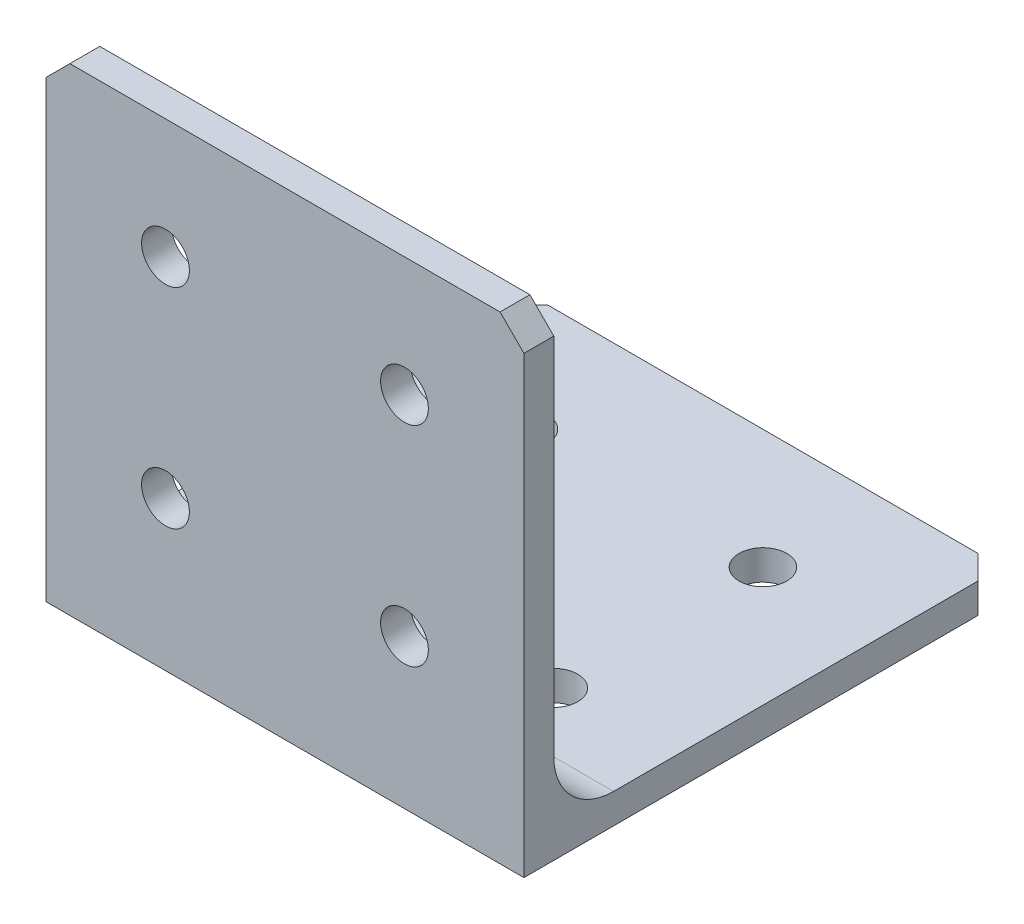
ISO-10303-21;
HEADER;
FILE_DESCRIPTION(('STEP AP214'),'2;1');
FILE_NAME('part.step','',(''),(''),'','','');
FILE_SCHEMA(('AUTOMOTIVE_DESIGN { 1 0 10303 214 1 1 1 1 }'));
ENDSEC;
DATA;
#1=APPLICATION_CONTEXT('core data for automotive mechanical design processes');
#2=APPLICATION_PROTOCOL_DEFINITION('international standard','automotive_design',2000,#1);
#3=PRODUCT_CONTEXT('',#1,'mechanical');
#4=PRODUCT('Part','Part','',(#3));
#5=PRODUCT_RELATED_PRODUCT_CATEGORY('part','',(#4));
#6=PRODUCT_DEFINITION_FORMATION('','',#4);
#7=PRODUCT_DEFINITION_CONTEXT('part definition',#1,'design');
#8=PRODUCT_DEFINITION('design','',#6,#7);
#9=PRODUCT_DEFINITION_SHAPE('','',#8);
#10=(LENGTH_UNIT() NAMED_UNIT(*) SI_UNIT(.MILLI.,.METRE.));
#11=(NAMED_UNIT(*) PLANE_ANGLE_UNIT() SI_UNIT($,.RADIAN.));
#12=(NAMED_UNIT(*) SI_UNIT($,.STERADIAN.) SOLID_ANGLE_UNIT());
#13=UNCERTAINTY_MEASURE_WITH_UNIT(LENGTH_MEASURE(1.E-05),#10,'distance_accuracy_value','');
#14=(GEOMETRIC_REPRESENTATION_CONTEXT(3) GLOBAL_UNCERTAINTY_ASSIGNED_CONTEXT((#13)) GLOBAL_UNIT_ASSIGNED_CONTEXT((#10,
#11,#12)) REPRESENTATION_CONTEXT('',''));
#15=CARTESIAN_POINT('',(0.,0.,0.));
#16=DIRECTION('',(0.,0.,1.));
#17=DIRECTION('',(1.,0.,0.));
#18=AXIS2_PLACEMENT_3D('',#15,#16,#17);
#19=CARTESIAN_POINT('',(50.8,0.,-50.8));
#20=DIRECTION('',(0.,1.,0.));
#21=DIRECTION('',(0.,0.,1.));
#22=AXIS2_PLACEMENT_3D('',#19,#20,#21);
#23=PLANE('',#22);
#24=CARTESIAN_POINT('',(38.1,0.,-15.875));
#25=DIRECTION('',(0.,-1.,0.));
#26=DIRECTION('',(0.,0.,-1.));
#27=AXIS2_PLACEMENT_3D('',#24,#25,#26);
#28=CIRCLE('',#27,2.54);
#29=CARTESIAN_POINT('',(38.1,0.,-18.415));
#30=VERTEX_POINT('',#29);
#31=EDGE_CURVE('E336',#30,#30,#28,.T.);
#32=ORIENTED_EDGE('',*,*,#31,.F.);
#33=EDGE_LOOP('',(#32));
#34=FACE_BOUND('',#33,.T.);
#35=CARTESIAN_POINT('',(12.7,0.,-38.1));
#36=DIRECTION('',(0.,-1.,0.));
#37=DIRECTION('',(0.,0.,-1.));
#38=AXIS2_PLACEMENT_3D('',#35,#36,#37);
#39=CIRCLE('',#38,2.54);
#40=CARTESIAN_POINT('',(12.7,0.,-40.64));
#41=VERTEX_POINT('',#40);
#42=EDGE_CURVE('E333',#41,#41,#39,.T.);
#43=ORIENTED_EDGE('',*,*,#42,.F.);
#44=EDGE_LOOP('',(#43));
#45=FACE_BOUND('',#44,.T.);
#46=CARTESIAN_POINT('',(12.7,0.,-15.875));
#47=DIRECTION('',(0.,-1.,0.));
#48=DIRECTION('',(0.,0.,-1.));
#49=AXIS2_PLACEMENT_3D('',#46,#47,#48);
#50=CIRCLE('',#49,2.54);
#51=CARTESIAN_POINT('',(12.7,0.,-18.415));
#52=VERTEX_POINT('',#51);
#53=EDGE_CURVE('E326',#52,#52,#50,.T.);
#54=ORIENTED_EDGE('',*,*,#53,.F.);
#55=EDGE_LOOP('',(#54));
#56=FACE_BOUND('',#55,.T.);
#57=CARTESIAN_POINT('',(38.1,0.,-38.1));
#58=DIRECTION('',(0.,-1.,0.));
#59=DIRECTION('',(0.,0.,-1.));
#60=AXIS2_PLACEMENT_3D('',#57,#58,#59);
#61=CIRCLE('',#60,2.54);
#62=CARTESIAN_POINT('',(38.1,0.,-40.64));
#63=VERTEX_POINT('',#62);
#64=EDGE_CURVE('E176',#63,#63,#61,.T.);
#65=ORIENTED_EDGE('',*,*,#64,.F.);
#66=EDGE_LOOP('',(#65));
#67=FACE_BOUND('',#66,.T.);
#68=DIRECTION('',(-1.,0.,0.));
#69=VECTOR('',#68,1.);
#70=CARTESIAN_POINT('',(50.8,0.,-50.8));
#71=LINE('',#70,#69);
#72=CARTESIAN_POINT('',(48.26,0.,-50.8));
#73=VERTEX_POINT('',#72);
#74=CARTESIAN_POINT('',(2.54,0.,-50.8));
#75=VERTEX_POINT('',#74);
#76=EDGE_CURVE('E169',#73,#75,#71,.T.);
#77=ORIENTED_EDGE('',*,*,#76,.F.);
#78=DIRECTION('',(-0.707106781186547,0.,-0.707106781186549));
#79=VECTOR('',#78,1.);
#80=CARTESIAN_POINT('',(50.8,0.,-48.26));
#81=LINE('',#80,#79);
#82=CARTESIAN_POINT('',(50.8,0.,-48.26));
#83=VERTEX_POINT('',#82);
#84=EDGE_CURVE('E11',#73,#83,#81,.F.);
#85=ORIENTED_EDGE('',*,*,#84,.T.);
#86=DIRECTION('',(0.,0.,-1.));
#87=VECTOR('',#86,1.);
#88=CARTESIAN_POINT('',(50.8,0.,-50.8));
#89=LINE('',#88,#87);
#90=CARTESIAN_POINT('',(50.8,0.,0.));
#91=VERTEX_POINT('',#90);
#92=EDGE_CURVE('E129',#91,#83,#89,.T.);
#93=ORIENTED_EDGE('',*,*,#92,.F.);
#94=DIRECTION('',(-1.,0.,0.));
#95=VECTOR('',#94,1.);
#96=CARTESIAN_POINT('',(50.8,0.,0.));
#97=LINE('',#96,#95);
#98=CARTESIAN_POINT('',(0.,0.,0.));
#99=VERTEX_POINT('',#98);
#100=EDGE_CURVE('E134',#91,#99,#97,.T.);
#101=ORIENTED_EDGE('',*,*,#100,.T.);
#102=DIRECTION('',(0.,0.,-1.));
#103=VECTOR('',#102,1.);
#104=CARTESIAN_POINT('',(0.,0.,-50.8));
#105=LINE('',#104,#103);
#106=CARTESIAN_POINT('',(0.,0.,-48.26));
#107=VERTEX_POINT('',#106);
#108=EDGE_CURVE('E155',#99,#107,#105,.T.);
#109=ORIENTED_EDGE('',*,*,#108,.T.);
#110=DIRECTION('',(0.707106781186547,0.,-0.707106781186548));
#111=VECTOR('',#110,1.);
#112=CARTESIAN_POINT('',(2.54,0.,-50.8));
#113=LINE('',#112,#111);
#114=EDGE_CURVE('E47',#107,#75,#113,.T.);
#115=ORIENTED_EDGE('',*,*,#114,.T.);
#116=EDGE_LOOP('',(#77,#85,#93,#101,#109,#115));
#117=FACE_BOUND('',#116,.T.);
#118=ADVANCED_FACE('F38',(#34,#45,#56,#67,#117),#23,.F.);
#119=CARTESIAN_POINT('',(50.8,3.175,-50.8));
#120=DIRECTION('',(0.,0.,1.));
#121=DIRECTION('',(1.,0.,0.));
#122=AXIS2_PLACEMENT_3D('',#119,#120,#121);
#123=PLANE('',#122);
#124=DIRECTION('',(-1.,0.,0.));
#125=VECTOR('',#124,1.);
#126=CARTESIAN_POINT('',(50.8,3.175,-50.8));
#127=LINE('',#126,#125);
#128=CARTESIAN_POINT('',(48.26,3.175,-50.8));
#129=VERTEX_POINT('',#128);
#130=CARTESIAN_POINT('',(2.54,3.175,-50.8));
#131=VERTEX_POINT('',#130);
#132=EDGE_CURVE('E166',#129,#131,#127,.T.);
#133=ORIENTED_EDGE('',*,*,#132,.F.);
#134=DIRECTION('',(0.,-1.,0.));
#135=VECTOR('',#134,1.);
#136=CARTESIAN_POINT('',(48.26,3.175,-50.8));
#137=LINE('',#136,#135);
#138=EDGE_CURVE('E60',#129,#73,#137,.T.);
#139=ORIENTED_EDGE('',*,*,#138,.T.);
#140=ORIENTED_EDGE('',*,*,#76,.T.);
#141=DIRECTION('',(0.,1.,0.));
#142=VECTOR('',#141,1.);
#143=CARTESIAN_POINT('',(2.54,3.175,-50.8));
#144=LINE('',#143,#142);
#145=EDGE_CURVE('E220',#75,#131,#144,.T.);
#146=ORIENTED_EDGE('',*,*,#145,.T.);
#147=EDGE_LOOP('',(#133,#139,#140,#146));
#148=FACE_BOUND('',#147,.T.);
#149=ADVANCED_FACE('F224',(#148),#123,.F.);
#150=CARTESIAN_POINT('',(50.8,3.175,-3.17500000000001));
#151=DIRECTION('',(0.,-1.,0.));
#152=DIRECTION('',(0.,0.,-1.));
#153=AXIS2_PLACEMENT_3D('',#150,#151,#152);
#154=PLANE('',#153);
#155=CARTESIAN_POINT('',(38.1,3.175,-15.875));
#156=DIRECTION('',(0.,-1.,0.));
#157=DIRECTION('',(0.,0.,-1.));
#158=AXIS2_PLACEMENT_3D('',#155,#156,#157);
#159=CIRCLE('',#158,2.54);
#160=CARTESIAN_POINT('',(38.1,3.175,-18.415));
#161=VERTEX_POINT('',#160);
#162=EDGE_CURVE('E182',#161,#161,#159,.T.);
#163=ORIENTED_EDGE('',*,*,#162,.T.);
#164=EDGE_LOOP('',(#163));
#165=FACE_BOUND('',#164,.T.);
#166=CARTESIAN_POINT('',(12.7,3.175,-38.1));
#167=DIRECTION('',(0.,-1.,0.));
#168=DIRECTION('',(0.,0.,-1.));
#169=AXIS2_PLACEMENT_3D('',#166,#167,#168);
#170=CIRCLE('',#169,2.54);
#171=CARTESIAN_POINT('',(12.7,3.175,-40.64));
#172=VERTEX_POINT('',#171);
#173=EDGE_CURVE('E179',#172,#172,#170,.T.);
#174=ORIENTED_EDGE('',*,*,#173,.T.);
#175=EDGE_LOOP('',(#174));
#176=FACE_BOUND('',#175,.T.);
#177=CARTESIAN_POINT('',(12.7,3.175,-15.875));
#178=DIRECTION('',(0.,-1.,0.));
#179=DIRECTION('',(0.,0.,-1.));
#180=AXIS2_PLACEMENT_3D('',#177,#178,#179);
#181=CIRCLE('',#180,2.54);
#182=CARTESIAN_POINT('',(12.7,3.175,-18.415));
#183=VERTEX_POINT('',#182);
#184=EDGE_CURVE('E175',#183,#183,#181,.T.);
#185=ORIENTED_EDGE('',*,*,#184,.T.);
#186=EDGE_LOOP('',(#185));
#187=FACE_BOUND('',#186,.T.);
#188=CARTESIAN_POINT('',(38.1,3.175,-38.1));
#189=DIRECTION('',(0.,-1.,0.));
#190=DIRECTION('',(0.,0.,-1.));
#191=AXIS2_PLACEMENT_3D('',#188,#189,#190);
#192=CIRCLE('',#191,2.54);
#193=CARTESIAN_POINT('',(38.1,3.175,-40.64));
#194=VERTEX_POINT('',#193);
#195=EDGE_CURVE('E172',#194,#194,#192,.T.);
#196=ORIENTED_EDGE('',*,*,#195,.T.);
#197=EDGE_LOOP('',(#196));
#198=FACE_BOUND('',#197,.T.);
#199=DIRECTION('',(0.,0.,1.));
#200=VECTOR('',#199,1.);
#201=CARTESIAN_POINT('',(50.8,3.175,-3.17500000000001));
#202=LINE('',#201,#200);
#203=CARTESIAN_POINT('',(50.8,3.175,-48.26));
#204=VERTEX_POINT('',#203);
#205=CARTESIAN_POINT('',(50.8,3.175,-9.525));
#206=VERTEX_POINT('',#205);
#207=EDGE_CURVE('E145',#204,#206,#202,.T.);
#208=ORIENTED_EDGE('',*,*,#207,.F.);
#209=DIRECTION('',(0.707106781186547,0.,0.707106781186549));
#210=VECTOR('',#209,1.);
#211=CARTESIAN_POINT('',(50.8,3.175,-48.26));
#212=LINE('',#211,#210);
#213=EDGE_CURVE('E218',#204,#129,#212,.F.);
#214=ORIENTED_EDGE('',*,*,#213,.T.);
#215=ORIENTED_EDGE('',*,*,#132,.T.);
#216=DIRECTION('',(-0.707106781186547,0.,0.707106781186548));
#217=VECTOR('',#216,1.);
#218=CARTESIAN_POINT('',(2.54,3.175,-50.8));
#219=LINE('',#218,#217);
#220=CARTESIAN_POINT('',(0.,3.175,-48.26));
#221=VERTEX_POINT('',#220);
#222=EDGE_CURVE('E216',#131,#221,#219,.T.);
#223=ORIENTED_EDGE('',*,*,#222,.T.);
#224=DIRECTION('',(0.,0.,1.));
#225=VECTOR('',#224,1.);
#226=CARTESIAN_POINT('',(0.,3.175,-3.17500000000001));
#227=LINE('',#226,#225);
#228=CARTESIAN_POINT('',(0.,3.175,-9.525));
#229=VERTEX_POINT('',#228);
#230=EDGE_CURVE('E157',#221,#229,#227,.T.);
#231=ORIENTED_EDGE('',*,*,#230,.T.);
#232=DIRECTION('',(-1.,0.,0.));
#233=VECTOR('',#232,1.);
#234=CARTESIAN_POINT('',(50.8,3.175,-9.525));
#235=LINE('',#234,#233);
#236=EDGE_CURVE('E188',#229,#206,#235,.F.);
#237=ORIENTED_EDGE('',*,*,#236,.T.);
#238=EDGE_LOOP('',(#208,#214,#215,#223,#231,#237));
#239=FACE_BOUND('',#238,.T.);
#240=ADVANCED_FACE('F228',(#165,#176,#187,#198,#239),#154,.F.);
#241=CARTESIAN_POINT('',(50.8,50.8,-3.175));
#242=DIRECTION('',(0.,0.,1.));
#243=DIRECTION('',(0.,-1.,0.));
#244=AXIS2_PLACEMENT_3D('',#241,#242,#243);
#245=PLANE('',#244);
#246=CARTESIAN_POINT('',(12.7,15.875,-3.175));
#247=DIRECTION('',(0.,0.,1.));
#248=DIRECTION('',(0.,-1.,0.));
#249=AXIS2_PLACEMENT_3D('',#246,#247,#248);
#250=CIRCLE('',#249,2.54);
#251=CARTESIAN_POINT('',(12.7,13.335,-3.175));
#252=VERTEX_POINT('',#251);
#253=EDGE_CURVE('E151',#252,#252,#250,.T.);
#254=ORIENTED_EDGE('',*,*,#253,.T.);
#255=EDGE_LOOP('',(#254));
#256=FACE_BOUND('',#255,.T.);
#257=CARTESIAN_POINT('',(38.1,38.1,-3.175));
#258=DIRECTION('',(0.,0.,1.));
#259=DIRECTION('',(0.,-1.,0.));
#260=AXIS2_PLACEMENT_3D('',#257,#258,#259);
#261=CIRCLE('',#260,2.54);
#262=CARTESIAN_POINT('',(38.1,35.56,-3.175));
#263=VERTEX_POINT('',#262);
#264=EDGE_CURVE('E359',#263,#263,#261,.T.);
#265=ORIENTED_EDGE('',*,*,#264,.T.);
#266=EDGE_LOOP('',(#265));
#267=FACE_BOUND('',#266,.T.);
#268=CARTESIAN_POINT('',(38.1,15.875,-3.175));
#269=DIRECTION('',(0.,0.,1.));
#270=DIRECTION('',(0.,-1.,0.));
#271=AXIS2_PLACEMENT_3D('',#268,#269,#270);
#272=CIRCLE('',#271,2.54);
#273=CARTESIAN_POINT('',(38.1,13.335,-3.175));
#274=VERTEX_POINT('',#273);
#275=EDGE_CURVE('E357',#274,#274,#272,.T.);
#276=ORIENTED_EDGE('',*,*,#275,.T.);
#277=EDGE_LOOP('',(#276));
#278=FACE_BOUND('',#277,.T.);
#279=CARTESIAN_POINT('',(12.7,38.1,-3.175));
#280=DIRECTION('',(0.,0.,1.));
#281=DIRECTION('',(0.,-1.,0.));
#282=AXIS2_PLACEMENT_3D('',#279,#280,#281);
#283=CIRCLE('',#282,2.54);
#284=CARTESIAN_POINT('',(12.7,35.56,-3.175));
#285=VERTEX_POINT('',#284);
#286=EDGE_CURVE('E354',#285,#285,#283,.T.);
#287=ORIENTED_EDGE('',*,*,#286,.T.);
#288=EDGE_LOOP('',(#287));
#289=FACE_BOUND('',#288,.T.);
#290=DIRECTION('',(-1.,0.,0.));
#291=VECTOR('',#290,1.);
#292=CARTESIAN_POINT('',(50.8,50.8,-3.175));
#293=LINE('',#292,#291);
#294=CARTESIAN_POINT('',(48.26,50.8,-3.175));
#295=VERTEX_POINT('',#294);
#296=CARTESIAN_POINT('',(2.54,50.8,-3.175));
#297=VERTEX_POINT('',#296);
#298=EDGE_CURVE('E163',#295,#297,#293,.T.);
#299=ORIENTED_EDGE('',*,*,#298,.F.);
#300=DIRECTION('',(-0.707106781186547,0.707106781186549,0.));
#301=VECTOR('',#300,1.);
#302=CARTESIAN_POINT('',(50.8,48.26,-3.175));
#303=LINE('',#302,#301);
#304=CARTESIAN_POINT('',(50.8,48.26,-3.175));
#305=VERTEX_POINT('',#304);
#306=EDGE_CURVE('E210',#295,#305,#303,.F.);
#307=ORIENTED_EDGE('',*,*,#306,.T.);
#308=DIRECTION('',(0.,1.,0.));
#309=VECTOR('',#308,1.);
#310=CARTESIAN_POINT('',(50.8,50.8,-3.175));
#311=LINE('',#310,#309);
#312=CARTESIAN_POINT('',(50.8,9.525,-3.175));
#313=VERTEX_POINT('',#312);
#314=EDGE_CURVE('E135',#313,#305,#311,.T.);
#315=ORIENTED_EDGE('',*,*,#314,.F.);
#316=DIRECTION('',(-1.,0.,0.));
#317=VECTOR('',#316,1.);
#318=CARTESIAN_POINT('',(0.,9.525,-3.17500000000001));
#319=LINE('',#318,#317);
#320=CARTESIAN_POINT('',(0.,9.525,-3.175));
#321=VERTEX_POINT('',#320);
#322=EDGE_CURVE('E171',#313,#321,#319,.T.);
#323=ORIENTED_EDGE('',*,*,#322,.T.);
#324=DIRECTION('',(0.,1.,0.));
#325=VECTOR('',#324,1.);
#326=CARTESIAN_POINT('',(0.,50.8,-3.175));
#327=LINE('',#326,#325);
#328=CARTESIAN_POINT('',(0.,48.26,-3.175));
#329=VERTEX_POINT('',#328);
#330=EDGE_CURVE('E148',#321,#329,#327,.T.);
#331=ORIENTED_EDGE('',*,*,#330,.T.);
#332=DIRECTION('',(0.707106781186547,0.707106781186548,0.));
#333=VECTOR('',#332,1.);
#334=CARTESIAN_POINT('',(2.54,50.8,-3.175));
#335=LINE('',#334,#333);
#336=EDGE_CURVE('E208',#329,#297,#335,.T.);
#337=ORIENTED_EDGE('',*,*,#336,.T.);
#338=EDGE_LOOP('',(#299,#307,#315,#323,#331,#337));
#339=FACE_BOUND('',#338,.T.);
#340=ADVANCED_FACE('F241',(#256,#267,#278,#289,#339),#245,.F.);
#341=CARTESIAN_POINT('',(50.8,50.8,0.));
#342=DIRECTION('',(0.,-1.,0.));
#343=DIRECTION('',(0.,0.,-1.));
#344=AXIS2_PLACEMENT_3D('',#341,#342,#343);
#345=PLANE('',#344);
#346=DIRECTION('',(-1.,0.,0.));
#347=VECTOR('',#346,1.);
#348=CARTESIAN_POINT('',(50.8,50.8,0.));
#349=LINE('',#348,#347);
#350=CARTESIAN_POINT('',(48.26,50.8,0.));
#351=VERTEX_POINT('',#350);
#352=CARTESIAN_POINT('',(2.54,50.8,0.));
#353=VERTEX_POINT('',#352);
#354=EDGE_CURVE('E142',#351,#353,#349,.T.);
#355=ORIENTED_EDGE('',*,*,#354,.F.);
#356=DIRECTION('',(0.,0.,-1.));
#357=VECTOR('',#356,1.);
#358=CARTESIAN_POINT('',(48.26,50.8,0.));
#359=LINE('',#358,#357);
#360=EDGE_CURVE('E206',#351,#295,#359,.T.);
#361=ORIENTED_EDGE('',*,*,#360,.T.);
#362=ORIENTED_EDGE('',*,*,#298,.T.);
#363=DIRECTION('',(0.,0.,1.));
#364=VECTOR('',#363,1.);
#365=CARTESIAN_POINT('',(2.54,50.8,0.));
#366=LINE('',#365,#364);
#367=EDGE_CURVE('E203',#297,#353,#366,.T.);
#368=ORIENTED_EDGE('',*,*,#367,.T.);
#369=EDGE_LOOP('',(#355,#361,#362,#368));
#370=FACE_BOUND('',#369,.T.);
#371=ADVANCED_FACE('F252',(#370),#345,.F.);
#372=CARTESIAN_POINT('',(50.8,0.,0.));
#373=DIRECTION('',(0.,0.,-1.));
#374=DIRECTION('',(-1.,0.,0.));
#375=AXIS2_PLACEMENT_3D('',#372,#373,#374);
#376=PLANE('',#375);
#377=CARTESIAN_POINT('',(12.7,15.875,0.));
#378=DIRECTION('',(0.,0.,1.));
#379=DIRECTION('',(1.,0.,0.));
#380=AXIS2_PLACEMENT_3D('',#377,#378,#379);
#381=CIRCLE('',#380,2.54);
#382=CARTESIAN_POINT('',(15.24,15.875,0.));
#383=VERTEX_POINT('',#382);
#384=EDGE_CURVE('E346',#383,#383,#381,.T.);
#385=ORIENTED_EDGE('',*,*,#384,.F.);
#386=EDGE_LOOP('',(#385));
#387=FACE_BOUND('',#386,.T.);
#388=CARTESIAN_POINT('',(38.1,38.1,0.));
#389=DIRECTION('',(0.,0.,1.));
#390=DIRECTION('',(1.,0.,0.));
#391=AXIS2_PLACEMENT_3D('',#388,#389,#390);
#392=CIRCLE('',#391,2.54);
#393=CARTESIAN_POINT('',(40.64,38.1,0.));
#394=VERTEX_POINT('',#393);
#395=EDGE_CURVE('E345',#394,#394,#392,.T.);
#396=ORIENTED_EDGE('',*,*,#395,.F.);
#397=EDGE_LOOP('',(#396));
#398=FACE_BOUND('',#397,.T.);
#399=CARTESIAN_POINT('',(38.1,15.875,0.));
#400=DIRECTION('',(0.,0.,1.));
#401=DIRECTION('',(1.,0.,0.));
#402=AXIS2_PLACEMENT_3D('',#399,#400,#401);
#403=CIRCLE('',#402,2.54);
#404=CARTESIAN_POINT('',(40.64,15.875,0.));
#405=VERTEX_POINT('',#404);
#406=EDGE_CURVE('E185',#405,#405,#403,.T.);
#407=ORIENTED_EDGE('',*,*,#406,.F.);
#408=EDGE_LOOP('',(#407));
#409=FACE_BOUND('',#408,.T.);
#410=CARTESIAN_POINT('',(12.7,38.1,0.));
#411=DIRECTION('',(0.,0.,1.));
#412=DIRECTION('',(1.,0.,0.));
#413=AXIS2_PLACEMENT_3D('',#410,#411,#412);
#414=CIRCLE('',#413,2.54);
#415=CARTESIAN_POINT('',(15.24,38.1,0.));
#416=VERTEX_POINT('',#415);
#417=EDGE_CURVE('E349',#416,#416,#414,.T.);
#418=ORIENTED_EDGE('',*,*,#417,.F.);
#419=EDGE_LOOP('',(#418));
#420=FACE_BOUND('',#419,.T.);
#421=DIRECTION('',(0.,-1.,0.));
#422=VECTOR('',#421,1.);
#423=CARTESIAN_POINT('',(50.8,0.,0.));
#424=LINE('',#423,#422);
#425=CARTESIAN_POINT('',(50.8,48.26,0.));
#426=VERTEX_POINT('',#425);
#427=EDGE_CURVE('E123',#426,#91,#424,.T.);
#428=ORIENTED_EDGE('',*,*,#427,.F.);
#429=DIRECTION('',(0.707106781186547,-0.707106781186549,0.));
#430=VECTOR('',#429,1.);
#431=CARTESIAN_POINT('',(50.8,48.26,0.));
#432=LINE('',#431,#430);
#433=EDGE_CURVE('E201',#426,#351,#432,.F.);
#434=ORIENTED_EDGE('',*,*,#433,.T.);
#435=ORIENTED_EDGE('',*,*,#354,.T.);
#436=DIRECTION('',(-0.707106781186547,-0.707106781186548,0.));
#437=VECTOR('',#436,1.);
#438=CARTESIAN_POINT('',(2.54,50.8,0.));
#439=LINE('',#438,#437);
#440=CARTESIAN_POINT('',(0.,48.26,0.));
#441=VERTEX_POINT('',#440);
#442=EDGE_CURVE('E199',#353,#441,#439,.T.);
#443=ORIENTED_EDGE('',*,*,#442,.T.);
#444=DIRECTION('',(0.,-1.,0.));
#445=VECTOR('',#444,1.);
#446=CARTESIAN_POINT('',(0.,0.,0.));
#447=LINE('',#446,#445);
#448=EDGE_CURVE('E140',#441,#99,#447,.T.);
#449=ORIENTED_EDGE('',*,*,#448,.T.);
#450=ORIENTED_EDGE('',*,*,#100,.F.);
#451=EDGE_LOOP('',(#428,#434,#435,#443,#449,#450));
#452=FACE_BOUND('',#451,.T.);
#453=ADVANCED_FACE('F138',(#387,#398,#409,#420,#452),#376,.F.);
#454=CARTESIAN_POINT('',(50.8,0.,0.));
#455=DIRECTION('',(-1.,0.,0.));
#456=DIRECTION('',(0.,0.,1.));
#457=AXIS2_PLACEMENT_3D('',#454,#455,#456);
#458=PLANE('',#457);
#459=ORIENTED_EDGE('',*,*,#314,.T.);
#460=DIRECTION('',(0.,0.,1.));
#461=VECTOR('',#460,1.);
#462=CARTESIAN_POINT('',(50.8,48.26,0.));
#463=LINE('',#462,#461);
#464=EDGE_CURVE('E132',#305,#426,#463,.T.);
#465=ORIENTED_EDGE('',*,*,#464,.T.);
#466=ORIENTED_EDGE('',*,*,#427,.T.);
#467=ORIENTED_EDGE('',*,*,#92,.T.);
#468=DIRECTION('',(0.,1.,0.));
#469=VECTOR('',#468,1.);
#470=CARTESIAN_POINT('',(50.8,0.,-48.26));
#471=LINE('',#470,#469);
#472=EDGE_CURVE('E196',#83,#204,#471,.T.);
#473=ORIENTED_EDGE('',*,*,#472,.T.);
#474=ORIENTED_EDGE('',*,*,#207,.T.);
#475=CARTESIAN_POINT('',(50.8,9.525,-9.525));
#476=DIRECTION('',(-1.,0.,0.));
#477=DIRECTION('',(0.,0.,1.));
#478=AXIS2_PLACEMENT_3D('',#475,#476,#477);
#479=CIRCLE('',#478,6.35);
#480=EDGE_CURVE('E194',#206,#313,#479,.T.);
#481=ORIENTED_EDGE('',*,*,#480,.T.);
#482=EDGE_LOOP('',(#459,#465,#466,#467,#473,#474,#481));
#483=FACE_BOUND('',#482,.T.);
#484=ADVANCED_FACE('F126',(#483),#458,.F.);
#485=CARTESIAN_POINT('',(0.,0.,0.));
#486=DIRECTION('',(-1.,0.,0.));
#487=DIRECTION('',(0.,0.,1.));
#488=AXIS2_PLACEMENT_3D('',#485,#486,#487);
#489=PLANE('',#488);
#490=ORIENTED_EDGE('',*,*,#448,.F.);
#491=DIRECTION('',(0.,0.,-1.));
#492=VECTOR('',#491,1.);
#493=CARTESIAN_POINT('',(0.,48.26,-3.175));
#494=LINE('',#493,#492);
#495=EDGE_CURVE('E214',#441,#329,#494,.T.);
#496=ORIENTED_EDGE('',*,*,#495,.T.);
#497=ORIENTED_EDGE('',*,*,#330,.F.);
#498=CARTESIAN_POINT('',(0.,9.525,-9.525));
#499=DIRECTION('',(-1.,0.,0.));
#500=DIRECTION('',(0.,0.,1.));
#501=AXIS2_PLACEMENT_3D('',#498,#499,#500);
#502=CIRCLE('',#501,6.35);
#503=EDGE_CURVE('E191',#321,#229,#502,.F.);
#504=ORIENTED_EDGE('',*,*,#503,.T.);
#505=ORIENTED_EDGE('',*,*,#230,.F.);
#506=DIRECTION('',(0.,-1.,0.));
#507=VECTOR('',#506,1.);
#508=CARTESIAN_POINT('',(0.,0.,-48.26));
#509=LINE('',#508,#507);
#510=EDGE_CURVE('E212',#221,#107,#509,.T.);
#511=ORIENTED_EDGE('',*,*,#510,.T.);
#512=ORIENTED_EDGE('',*,*,#108,.F.);
#513=EDGE_LOOP('',(#490,#496,#497,#504,#505,#511,#512));
#514=FACE_BOUND('',#513,.T.);
#515=ADVANCED_FACE('F244',(#514),#489,.T.);
#516=CARTESIAN_POINT('',(12.7,38.1,-50.8));
#517=DIRECTION('',(0.,0.,1.));
#518=DIRECTION('',(1.,0.,0.));
#519=AXIS2_PLACEMENT_3D('',#516,#517,#518);
#520=CYLINDRICAL_SURFACE('',#519,2.54);
#521=ORIENTED_EDGE('',*,*,#417,.T.);
#522=EDGE_LOOP('',(#521));
#523=FACE_BOUND('',#522,.T.);
#524=ORIENTED_EDGE('',*,*,#286,.F.);
#525=EDGE_LOOP('',(#524));
#526=FACE_BOUND('',#525,.T.);
#527=ADVANCED_FACE('F289',(#523,#526),#520,.F.);
#528=CARTESIAN_POINT('',(38.1,15.875,-50.8));
#529=DIRECTION('',(0.,0.,1.));
#530=DIRECTION('',(1.,0.,0.));
#531=AXIS2_PLACEMENT_3D('',#528,#529,#530);
#532=CYLINDRICAL_SURFACE('',#531,2.54);
#533=ORIENTED_EDGE('',*,*,#406,.T.);
#534=EDGE_LOOP('',(#533));
#535=FACE_BOUND('',#534,.T.);
#536=ORIENTED_EDGE('',*,*,#275,.F.);
#537=EDGE_LOOP('',(#536));
#538=FACE_BOUND('',#537,.T.);
#539=ADVANCED_FACE('F294',(#535,#538),#532,.F.);
#540=CARTESIAN_POINT('',(38.1,38.1,-50.8));
#541=DIRECTION('',(0.,0.,1.));
#542=DIRECTION('',(1.,0.,0.));
#543=AXIS2_PLACEMENT_3D('',#540,#541,#542);
#544=CYLINDRICAL_SURFACE('',#543,2.54);
#545=ORIENTED_EDGE('',*,*,#395,.T.);
#546=EDGE_LOOP('',(#545));
#547=FACE_BOUND('',#546,.T.);
#548=ORIENTED_EDGE('',*,*,#264,.F.);
#549=EDGE_LOOP('',(#548));
#550=FACE_BOUND('',#549,.T.);
#551=ADVANCED_FACE('F296',(#547,#550),#544,.F.);
#552=CARTESIAN_POINT('',(12.7,15.875,-50.8));
#553=DIRECTION('',(0.,0.,1.));
#554=DIRECTION('',(1.,0.,0.));
#555=AXIS2_PLACEMENT_3D('',#552,#553,#554);
#556=CYLINDRICAL_SURFACE('',#555,2.54);
#557=ORIENTED_EDGE('',*,*,#384,.T.);
#558=EDGE_LOOP('',(#557));
#559=FACE_BOUND('',#558,.T.);
#560=ORIENTED_EDGE('',*,*,#253,.F.);
#561=EDGE_LOOP('',(#560));
#562=FACE_BOUND('',#561,.T.);
#563=ADVANCED_FACE('F299',(#559,#562),#556,.F.);
#564=CARTESIAN_POINT('',(38.1,50.8,-38.1));
#565=DIRECTION('',(0.,-1.,0.));
#566=DIRECTION('',(0.,0.,-1.));
#567=AXIS2_PLACEMENT_3D('',#564,#565,#566);
#568=CYLINDRICAL_SURFACE('',#567,2.54);
#569=ORIENTED_EDGE('',*,*,#64,.T.);
#570=EDGE_LOOP('',(#569));
#571=FACE_BOUND('',#570,.T.);
#572=ORIENTED_EDGE('',*,*,#195,.F.);
#573=EDGE_LOOP('',(#572));
#574=FACE_BOUND('',#573,.T.);
#575=ADVANCED_FACE('F303',(#571,#574),#568,.F.);
#576=CARTESIAN_POINT('',(12.7,50.8,-15.875));
#577=DIRECTION('',(0.,-1.,0.));
#578=DIRECTION('',(0.,0.,-1.));
#579=AXIS2_PLACEMENT_3D('',#576,#577,#578);
#580=CYLINDRICAL_SURFACE('',#579,2.54);
#581=ORIENTED_EDGE('',*,*,#53,.T.);
#582=EDGE_LOOP('',(#581));
#583=FACE_BOUND('',#582,.T.);
#584=ORIENTED_EDGE('',*,*,#184,.F.);
#585=EDGE_LOOP('',(#584));
#586=FACE_BOUND('',#585,.T.);
#587=ADVANCED_FACE('F310',(#583,#586),#580,.F.);
#588=CARTESIAN_POINT('',(12.7,50.8,-38.1));
#589=DIRECTION('',(0.,-1.,0.));
#590=DIRECTION('',(0.,0.,-1.));
#591=AXIS2_PLACEMENT_3D('',#588,#589,#590);
#592=CYLINDRICAL_SURFACE('',#591,2.54);
#593=ORIENTED_EDGE('',*,*,#42,.T.);
#594=EDGE_LOOP('',(#593));
#595=FACE_BOUND('',#594,.T.);
#596=ORIENTED_EDGE('',*,*,#173,.F.);
#597=EDGE_LOOP('',(#596));
#598=FACE_BOUND('',#597,.T.);
#599=ADVANCED_FACE('F312',(#595,#598),#592,.F.);
#600=CARTESIAN_POINT('',(38.1,50.8,-15.875));
#601=DIRECTION('',(0.,-1.,0.));
#602=DIRECTION('',(0.,0.,-1.));
#603=AXIS2_PLACEMENT_3D('',#600,#601,#602);
#604=CYLINDRICAL_SURFACE('',#603,2.54);
#605=ORIENTED_EDGE('',*,*,#31,.T.);
#606=EDGE_LOOP('',(#605));
#607=FACE_BOUND('',#606,.T.);
#608=ORIENTED_EDGE('',*,*,#162,.F.);
#609=EDGE_LOOP('',(#608));
#610=FACE_BOUND('',#609,.T.);
#611=ADVANCED_FACE('F263',(#607,#610),#604,.F.);
#612=CARTESIAN_POINT('',(50.8,9.525,-9.525));
#613=DIRECTION('',(1.,0.,0.));
#614=DIRECTION('',(0.,0.,-1.));
#615=AXIS2_PLACEMENT_3D('',#612,#613,#614);
#616=CYLINDRICAL_SURFACE('',#615,6.35);
#617=ORIENTED_EDGE('',*,*,#480,.F.);
#618=ORIENTED_EDGE('',*,*,#236,.F.);
#619=ORIENTED_EDGE('',*,*,#503,.F.);
#620=ORIENTED_EDGE('',*,*,#322,.F.);
#621=EDGE_LOOP('',(#617,#618,#619,#620));
#622=FACE_BOUND('',#621,.T.);
#623=ADVANCED_FACE('F237',(#622),#616,.F.);
#624=CARTESIAN_POINT('',(50.8,48.26,0.));
#625=DIRECTION('',(-0.707106781186549,-0.707106781186547,0.));
#626=DIRECTION('',(0.,0.,1.));
#627=AXIS2_PLACEMENT_3D('',#624,#625,#626);
#628=PLANE('',#627);
#629=ORIENTED_EDGE('',*,*,#306,.F.);
#630=ORIENTED_EDGE('',*,*,#360,.F.);
#631=ORIENTED_EDGE('',*,*,#433,.F.);
#632=ORIENTED_EDGE('',*,*,#464,.F.);
#633=EDGE_LOOP('',(#629,#630,#631,#632));
#634=FACE_BOUND('',#633,.T.);
#635=ADVANCED_FACE('F255',(#634),#628,.F.);
#636=CARTESIAN_POINT('',(2.54,50.8,0.));
#637=DIRECTION('',(-0.707106781186548,0.707106781186547,0.));
#638=DIRECTION('',(0.,0.,-1.));
#639=AXIS2_PLACEMENT_3D('',#636,#637,#638);
#640=PLANE('',#639);
#641=ORIENTED_EDGE('',*,*,#336,.F.);
#642=ORIENTED_EDGE('',*,*,#495,.F.);
#643=ORIENTED_EDGE('',*,*,#442,.F.);
#644=ORIENTED_EDGE('',*,*,#367,.F.);
#645=EDGE_LOOP('',(#641,#642,#643,#644));
#646=FACE_BOUND('',#645,.T.);
#647=ADVANCED_FACE('F247',(#646),#640,.T.);
#648=CARTESIAN_POINT('',(50.8,0.,-48.26));
#649=DIRECTION('',(-0.707106781186549,0.,0.707106781186547));
#650=DIRECTION('',(0.,1.,0.));
#651=AXIS2_PLACEMENT_3D('',#648,#649,#650);
#652=PLANE('',#651);
#653=ORIENTED_EDGE('',*,*,#84,.F.);
#654=ORIENTED_EDGE('',*,*,#138,.F.);
#655=ORIENTED_EDGE('',*,*,#213,.F.);
#656=ORIENTED_EDGE('',*,*,#472,.F.);
#657=EDGE_LOOP('',(#653,#654,#655,#656));
#658=FACE_BOUND('',#657,.T.);
#659=ADVANCED_FACE('F231',(#658),#652,.F.);
#660=CARTESIAN_POINT('',(2.54,3.175,-50.8));
#661=DIRECTION('',(-0.707106781186548,0.,-0.707106781186547));
#662=DIRECTION('',(0.,-1.,0.));
#663=AXIS2_PLACEMENT_3D('',#660,#661,#662);
#664=PLANE('',#663);
#665=ORIENTED_EDGE('',*,*,#114,.F.);
#666=ORIENTED_EDGE('',*,*,#510,.F.);
#667=ORIENTED_EDGE('',*,*,#222,.F.);
#668=ORIENTED_EDGE('',*,*,#145,.F.);
#669=EDGE_LOOP('',(#665,#666,#667,#668));
#670=FACE_BOUND('',#669,.T.);
#671=ADVANCED_FACE('F41',(#670),#664,.T.);
#672=CLOSED_SHELL('',(#118,#149,#240,#340,#371,#453,#484,#515,#527,#539,#551,#563,#575,#587,
#599,#611,#623,#635,#647,#659,#671));
#673=MANIFOLD_SOLID_BREP('B2',#672);
#674=ADVANCED_BREP_SHAPE_REPRESENTATION('',(#18,#673),#14);
#675=SHAPE_DEFINITION_REPRESENTATION(#9,#674);
ENDSEC;
END-ISO-10303-21;
